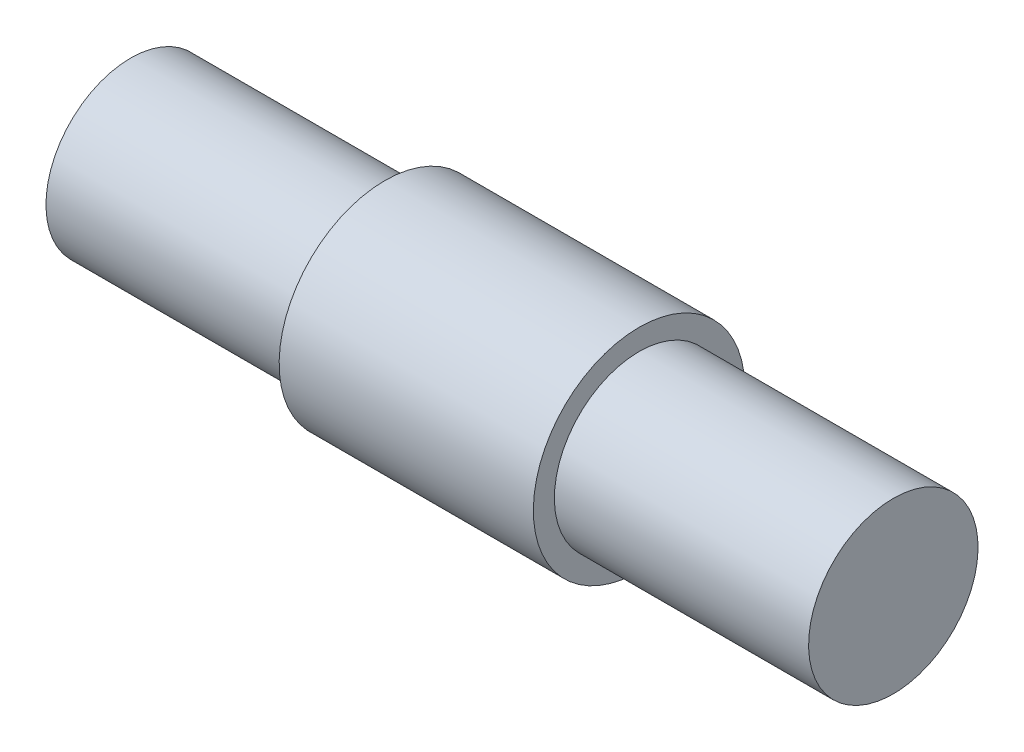
ISO-10303-21;
HEADER;
FILE_DESCRIPTION(('STEP AP214'),'2;1');
FILE_NAME('part.step','',(''),(''),'','','');
FILE_SCHEMA(('AUTOMOTIVE_DESIGN { 1 0 10303 214 1 1 1 1 }'));
ENDSEC;
DATA;
#1=APPLICATION_CONTEXT('core data for automotive mechanical design processes');
#2=APPLICATION_PROTOCOL_DEFINITION('international standard','automotive_design',2000,#1);
#3=PRODUCT_CONTEXT('',#1,'mechanical');
#4=PRODUCT('Part','Part','',(#3));
#5=PRODUCT_RELATED_PRODUCT_CATEGORY('part','',(#4));
#6=PRODUCT_DEFINITION_FORMATION('','',#4);
#7=PRODUCT_DEFINITION_CONTEXT('part definition',#1,'design');
#8=PRODUCT_DEFINITION('design','',#6,#7);
#9=PRODUCT_DEFINITION_SHAPE('','',#8);
#10=(LENGTH_UNIT() NAMED_UNIT(*) SI_UNIT(.MILLI.,.METRE.));
#11=(NAMED_UNIT(*) PLANE_ANGLE_UNIT() SI_UNIT($,.RADIAN.));
#12=(NAMED_UNIT(*) SI_UNIT($,.STERADIAN.) SOLID_ANGLE_UNIT());
#13=UNCERTAINTY_MEASURE_WITH_UNIT(LENGTH_MEASURE(1.E-05),#10,'distance_accuracy_value','');
#14=(GEOMETRIC_REPRESENTATION_CONTEXT(3) GLOBAL_UNCERTAINTY_ASSIGNED_CONTEXT((#13)) GLOBAL_UNIT_ASSIGNED_CONTEXT((#10,
#11,#12)) REPRESENTATION_CONTEXT('',''));
#15=CARTESIAN_POINT('',(0.,0.,0.));
#16=DIRECTION('',(0.,0.,1.));
#17=DIRECTION('',(1.,0.,0.));
#18=AXIS2_PLACEMENT_3D('',#15,#16,#17);
#19=CARTESIAN_POINT('',(14.2875,0.,0.));
#20=DIRECTION('',(1.,0.,0.));
#21=DIRECTION('',(0.,1.,0.));
#22=AXIS2_PLACEMENT_3D('',#19,#20,#21);
#23=PLANE('',#22);
#24=CARTESIAN_POINT('',(14.2875,0.,0.));
#25=DIRECTION('',(1.,0.,0.));
#26=DIRECTION('',(0.,1.,0.));
#27=AXIS2_PLACEMENT_3D('',#24,#25,#26);
#28=CIRCLE('',#27,3.175);
#29=CARTESIAN_POINT('',(14.2875,3.175,0.));
#30=VERTEX_POINT('',#29);
#31=EDGE_CURVE('E10',#30,#30,#28,.T.);
#32=ORIENTED_EDGE('',*,*,#31,.T.);
#33=EDGE_LOOP('',(#32));
#34=FACE_BOUND('',#33,.T.);
#35=ADVANCED_FACE('F39',(#34),#23,.T.);
#36=CARTESIAN_POINT('',(-4.7625,0.,0.));
#37=DIRECTION('',(1.,0.,0.));
#38=DIRECTION('',(0.,1.,0.));
#39=AXIS2_PLACEMENT_3D('',#36,#37,#38);
#40=CYLINDRICAL_SURFACE('',#39,3.175);
#41=ORIENTED_EDGE('',*,*,#31,.F.);
#42=EDGE_LOOP('',(#41));
#43=FACE_BOUND('',#42,.T.);
#44=CARTESIAN_POINT('',(4.7625,0.,0.));
#45=DIRECTION('',(1.,0.,0.));
#46=DIRECTION('',(0.,1.,0.));
#47=AXIS2_PLACEMENT_3D('',#44,#45,#46);
#48=CIRCLE('',#47,3.175);
#49=CARTESIAN_POINT('',(4.7625,3.175,0.));
#50=VERTEX_POINT('',#49);
#51=EDGE_CURVE('E46',#50,#50,#48,.T.);
#52=ORIENTED_EDGE('',*,*,#51,.T.);
#53=EDGE_LOOP('',(#52));
#54=FACE_BOUND('',#53,.T.);
#55=ADVANCED_FACE('F83',(#43,#54),#40,.T.);
#56=CARTESIAN_POINT('',(4.7625,0.,0.));
#57=DIRECTION('',(1.,0.,0.));
#58=DIRECTION('',(0.,1.,0.));
#59=AXIS2_PLACEMENT_3D('',#56,#57,#58);
#60=PLANE('',#59);
#61=CARTESIAN_POINT('',(4.7625,0.,0.));
#62=DIRECTION('',(1.,0.,0.));
#63=DIRECTION('',(0.,1.,0.));
#64=AXIS2_PLACEMENT_3D('',#61,#62,#63);
#65=CIRCLE('',#64,3.9624);
#66=CARTESIAN_POINT('',(4.7625,3.9624,0.));
#67=VERTEX_POINT('',#66);
#68=EDGE_CURVE('E51',#67,#67,#65,.T.);
#69=ORIENTED_EDGE('',*,*,#68,.T.);
#70=EDGE_LOOP('',(#69));
#71=FACE_BOUND('',#70,.T.);
#72=ORIENTED_EDGE('',*,*,#51,.F.);
#73=EDGE_LOOP('',(#72));
#74=FACE_BOUND('',#73,.T.);
#75=ADVANCED_FACE('F87',(#71,#74),#60,.T.);
#76=CARTESIAN_POINT('',(-4.7625,0.,0.));
#77=DIRECTION('',(1.,0.,0.));
#78=DIRECTION('',(0.,1.,0.));
#79=AXIS2_PLACEMENT_3D('',#76,#77,#78);
#80=CYLINDRICAL_SURFACE('',#79,3.9624);
#81=ORIENTED_EDGE('',*,*,#68,.F.);
#82=EDGE_LOOP('',(#81));
#83=FACE_BOUND('',#82,.T.);
#84=CARTESIAN_POINT('',(-4.7625,0.,0.));
#85=DIRECTION('',(1.,0.,0.));
#86=DIRECTION('',(0.,1.,0.));
#87=AXIS2_PLACEMENT_3D('',#84,#85,#86);
#88=CIRCLE('',#87,3.9624);
#89=CARTESIAN_POINT('',(-4.7625,3.9624,0.));
#90=VERTEX_POINT('',#89);
#91=EDGE_CURVE('E56',#90,#90,#88,.T.);
#92=ORIENTED_EDGE('',*,*,#91,.T.);
#93=EDGE_LOOP('',(#92));
#94=FACE_BOUND('',#93,.T.);
#95=ADVANCED_FACE('F92',(#83,#94),#80,.T.);
#96=CARTESIAN_POINT('',(-4.7625,0.,0.));
#97=DIRECTION('',(1.,0.,0.));
#98=DIRECTION('',(0.,1.,0.));
#99=AXIS2_PLACEMENT_3D('',#96,#97,#98);
#100=PLANE('',#99);
#101=ORIENTED_EDGE('',*,*,#91,.F.);
#102=EDGE_LOOP('',(#101));
#103=FACE_BOUND('',#102,.T.);
#104=CARTESIAN_POINT('',(-4.7625,0.,0.));
#105=DIRECTION('',(1.,0.,0.));
#106=DIRECTION('',(0.,1.,0.));
#107=AXIS2_PLACEMENT_3D('',#104,#105,#106);
#108=CIRCLE('',#107,3.175);
#109=CARTESIAN_POINT('',(-4.7625,3.175,0.));
#110=VERTEX_POINT('',#109);
#111=EDGE_CURVE('E62',#110,#110,#108,.T.);
#112=ORIENTED_EDGE('',*,*,#111,.T.);
#113=EDGE_LOOP('',(#112));
#114=FACE_BOUND('',#113,.T.);
#115=ADVANCED_FACE('F80',(#103,#114),#100,.F.);
#116=CARTESIAN_POINT('',(-4.7625,0.,0.));
#117=DIRECTION('',(1.,0.,0.));
#118=DIRECTION('',(0.,1.,0.));
#119=AXIS2_PLACEMENT_3D('',#116,#117,#118);
#120=CYLINDRICAL_SURFACE('',#119,3.175);
#121=CARTESIAN_POINT('',(-14.2875,0.,0.));
#122=DIRECTION('',(1.,0.,0.));
#123=DIRECTION('',(0.,1.,0.));
#124=AXIS2_PLACEMENT_3D('',#121,#122,#123);
#125=CIRCLE('',#124,3.175);
#126=CARTESIAN_POINT('',(-14.2875,3.175,0.));
#127=VERTEX_POINT('',#126);
#128=EDGE_CURVE('E66',#127,#127,#125,.T.);
#129=ORIENTED_EDGE('',*,*,#128,.T.);
#130=EDGE_LOOP('',(#129));
#131=FACE_BOUND('',#130,.T.);
#132=ORIENTED_EDGE('',*,*,#111,.F.);
#133=EDGE_LOOP('',(#132));
#134=FACE_BOUND('',#133,.T.);
#135=ADVANCED_FACE('F71',(#131,#134),#120,.T.);
#136=CARTESIAN_POINT('',(-14.2875,0.,0.));
#137=DIRECTION('',(1.,0.,0.));
#138=DIRECTION('',(0.,1.,0.));
#139=AXIS2_PLACEMENT_3D('',#136,#137,#138);
#140=PLANE('',#139);
#141=ORIENTED_EDGE('',*,*,#128,.F.);
#142=EDGE_LOOP('',(#141));
#143=FACE_BOUND('',#142,.T.);
#144=ADVANCED_FACE('F74',(#143),#140,.F.);
#145=CLOSED_SHELL('',(#35,#55,#75,#95,#115,#135,#144));
#146=MANIFOLD_SOLID_BREP('B2',#145);
#147=ADVANCED_BREP_SHAPE_REPRESENTATION('',(#18,#146),#14);
#148=SHAPE_DEFINITION_REPRESENTATION(#9,#147);
ENDSEC;
END-ISO-10303-21;
